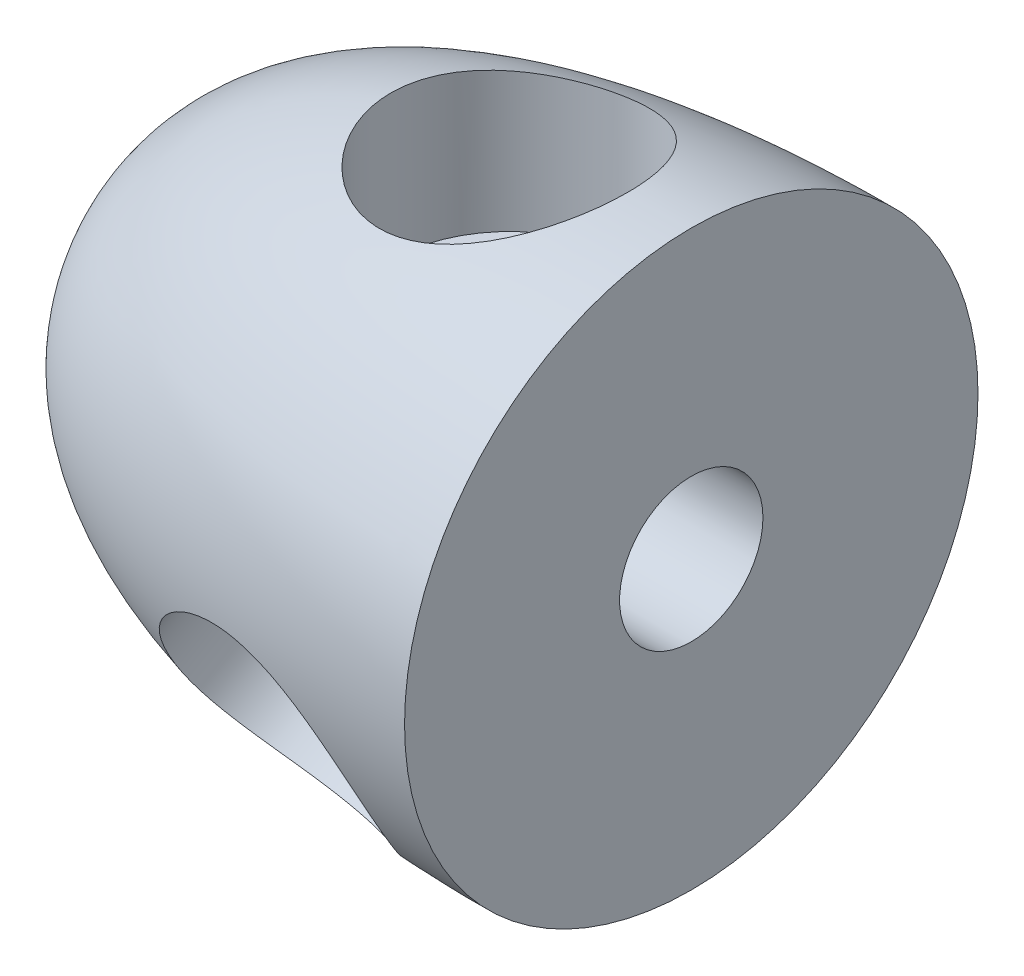
ISO-10303-21;
HEADER;
FILE_DESCRIPTION(('STEP AP214'),'2;1');
FILE_NAME('part.step','',(''),(''),'','','');
FILE_SCHEMA(('AUTOMOTIVE_DESIGN { 1 0 10303 214 1 1 1 1 }'));
ENDSEC;
DATA;
#1=APPLICATION_CONTEXT('core data for automotive mechanical design processes');
#2=APPLICATION_PROTOCOL_DEFINITION('international standard','automotive_design',2000,#1);
#3=PRODUCT_CONTEXT('',#1,'mechanical');
#4=PRODUCT('Part','Part','',(#3));
#5=PRODUCT_RELATED_PRODUCT_CATEGORY('part','',(#4));
#6=PRODUCT_DEFINITION_FORMATION('','',#4);
#7=PRODUCT_DEFINITION_CONTEXT('part definition',#1,'design');
#8=PRODUCT_DEFINITION('design','',#6,#7);
#9=PRODUCT_DEFINITION_SHAPE('','',#8);
#10=(LENGTH_UNIT() NAMED_UNIT(*) SI_UNIT(.MILLI.,.METRE.));
#11=(NAMED_UNIT(*) PLANE_ANGLE_UNIT() SI_UNIT($,.RADIAN.));
#12=(NAMED_UNIT(*) SI_UNIT($,.STERADIAN.) SOLID_ANGLE_UNIT());
#13=UNCERTAINTY_MEASURE_WITH_UNIT(LENGTH_MEASURE(1.E-05),#10,'distance_accuracy_value','');
#14=(GEOMETRIC_REPRESENTATION_CONTEXT(3) GLOBAL_UNCERTAINTY_ASSIGNED_CONTEXT((#13)) GLOBAL_UNIT_ASSIGNED_CONTEXT((#10,
#11,#12)) REPRESENTATION_CONTEXT('',''));
#15=CARTESIAN_POINT('',(0.,0.,0.));
#16=DIRECTION('',(0.,0.,1.));
#17=DIRECTION('',(1.,0.,0.));
#18=AXIS2_PLACEMENT_3D('',#15,#16,#17);
#19=CARTESIAN_POINT('',(0.,20.,0.));
#20=CARTESIAN_POINT('',(-14.46163506969,20.,0.));
#21=CARTESIAN_POINT('',(-38.5,17.4163862746272,0.));
#22=CARTESIAN_POINT('',(-38.5,0.,0.));
#23=B_SPLINE_CURVE_WITH_KNOTS('',3,(#19,#20,#21,#22),.UNSPECIFIED.,.F.,.F.,(4,4),(0.,1.),.UNSPECIFIED.);
#24=CARTESIAN_POINT('',(0.,0.,0.));
#25=DIRECTION('',(1.,0.,0.));
#26=AXIS1_PLACEMENT('',#24,#25);
#27=SURFACE_OF_REVOLUTION('',#23,#26);
#28=CARTESIAN_POINT('',(-12.7,-15.8421062460031,-10.9393329169819));
#29=CARTESIAN_POINT('',(-12.4667718551591,-15.8585433252204,-10.9678045605675));
#30=CARTESIAN_POINT('',(-12.2340146072822,-15.8681369570805,-11.004217427644));
#31=CARTESIAN_POINT('',(-11.7712364735395,-15.8736639800155,-11.0923043389169));
#32=CARTESIAN_POINT('',(-11.5412159015495,-15.8695958190582,-11.1439801164305));
#33=CARTESIAN_POINT('',(-11.0854103190266,-15.8478589256202,-11.2617605081061));
#34=CARTESIAN_POINT('',(-10.859628013026,-15.8301817922321,-11.3278740167084));
#35=CARTESIAN_POINT('',(-10.4139123783304,-15.781302848207,-11.4734647578628));
#36=CARTESIAN_POINT('',(-10.1939793323805,-15.750100385031,-11.5529426350749));
#37=CARTESIAN_POINT('',(-9.76194252633581,-15.674375544408,-11.7238310192057));
#38=CARTESIAN_POINT('',(-9.54981743445234,-15.6298930413038,-11.8152053493589));
#39=CARTESIAN_POINT('',(-9.13395442118094,-15.5276740292496,-12.0088035666243));
#40=CARTESIAN_POINT('',(-8.93021430947051,-15.4699410078469,-12.1110245950769));
#41=CARTESIAN_POINT('',(-8.53222101794735,-15.3413118656078,-12.325019559384));
#42=CARTESIAN_POINT('',(-8.33796473999528,-15.2704200802571,-12.4367903423044));
#43=CARTESIAN_POINT('',(-7.95969344561626,-15.1154491821787,-12.6687353864047));
#44=CARTESIAN_POINT('',(-7.77568987465328,-15.0313557163269,-12.7889187141263));
#45=CARTESIAN_POINT('',(-7.41046878904219,-14.8456991364132,-13.0422844230931));
#46=CARTESIAN_POINT('',(-7.22982288829782,-14.7434849032173,-13.175814791451));
#47=CARTESIAN_POINT('',(-6.88229916665005,-14.5248228947538,-13.4489973692947));
#48=CARTESIAN_POINT('',(-6.71542119324039,-14.4083752771838,-13.5886495109438));
#49=CARTESIAN_POINT('',(-6.39658821561442,-14.1614291811405,-13.8725076712));
#50=CARTESIAN_POINT('',(-6.24463315352734,-14.0309307571601,-14.0167136721445));
#51=CARTESIAN_POINT('',(-5.9568996964979,-13.7562434098754,-14.3079968409556));
#52=CARTESIAN_POINT('',(-5.82111282523077,-13.6120617320298,-14.4550724569084));
#53=CARTESIAN_POINT('',(-5.56778130318162,-13.3115433267783,-14.7493919118753));
#54=CARTESIAN_POINT('',(-5.45010510637893,-13.1553079697358,-14.8966258657814));
#55=CARTESIAN_POINT('',(-5.23299674737624,-12.8304976792463,-15.1905939175841));
#56=CARTESIAN_POINT('',(-5.13354819714245,-12.6619340225697,-15.3373283469195));
#57=CARTESIAN_POINT('',(-4.95385951517676,-12.3132328505923,-15.628734124103));
#58=CARTESIAN_POINT('',(-4.87361556521771,-12.1330976449764,-15.773405876661));
#59=CARTESIAN_POINT('',(-4.73326081524445,-11.762308801365,-16.0590786334291));
#60=CARTESIAN_POINT('',(-4.67315256567265,-11.5716538344673,-16.2000791705485));
#61=CARTESIAN_POINT('',(-4.57784438519257,-11.196907396192,-16.4656780473778));
#62=CARTESIAN_POINT('',(-4.54103473853576,-11.013513769783,-16.5906854553437));
#63=CARTESIAN_POINT('',(-4.48554938315257,-10.6403234066026,-16.8350310708724));
#64=CARTESIAN_POINT('',(-4.46687244495865,-10.4505271048605,-16.9543696622809));
#65=CARTESIAN_POINT('',(-4.4478780579426,-10.0660285793233,-17.1862858595509));
#66=CARTESIAN_POINT('',(-4.44755513718356,-9.87132783502268,-17.298865470488));
#67=CARTESIAN_POINT('',(-4.46525927059064,-9.47852946640415,-17.5163954505091));
#68=CARTESIAN_POINT('',(-4.4832860557062,-9.28043189193374,-17.6213459314303));
#69=CARTESIAN_POINT('',(-4.53595634422012,-8.89359481749504,-17.8172624669073));
#70=CARTESIAN_POINT('',(-4.56961649375037,-8.7049499497614,-17.9086820759108));
#71=CARTESIAN_POINT('',(-4.65274635233297,-8.32749582625799,-18.0836215211304));
#72=CARTESIAN_POINT('',(-4.70221528263639,-8.13868657904244,-18.1671417462118));
#73=CARTESIAN_POINT('',(-4.81647723685187,-7.76226358389381,-18.3259993819725));
#74=CARTESIAN_POINT('',(-4.88127105118392,-7.57464989813762,-18.4013363702879));
#75=CARTESIAN_POINT('',(-5.02558421182367,-7.20194857639171,-18.5436883771845));
#76=CARTESIAN_POINT('',(-5.10510408183272,-7.01686103049029,-18.6107030996601));
#77=CARTESIAN_POINT('',(-5.28054013531686,-6.645505752485,-18.7381147812127));
#78=CARTESIAN_POINT('',(-5.37684243349815,-6.45934209554645,-18.7982830343508));
#79=CARTESIAN_POINT('',(-5.58351619411861,-6.09223011402602,-18.9099910016891));
#80=CARTESIAN_POINT('',(-5.69389271856595,-5.91128369475498,-18.9615275958773));
#81=CARTESIAN_POINT('',(-5.92786692072594,-5.55588136722987,-19.0561858534896));
#82=CARTESIAN_POINT('',(-6.0514636798979,-5.38142500918062,-19.0993081009546));
#83=CARTESIAN_POINT('',(-6.3111089004628,-5.0400487739795,-19.1774826718875));
#84=CARTESIAN_POINT('',(-6.44716183212849,-4.87313163484989,-19.212532082184));
#85=CARTESIAN_POINT('',(-6.74221653036389,-4.53494898033521,-19.2774259068033));
#86=CARTESIAN_POINT('',(-6.90218335348832,-4.36440177694918,-19.3066306152169));
#87=CARTESIAN_POINT('',(-7.23464681497215,-4.03465828136709,-19.3566066649039));
#88=CARTESIAN_POINT('',(-7.40714411119247,-3.87546258600598,-19.3773775630169));
#89=CARTESIAN_POINT('',(-7.76376824003566,-3.56955669693395,-19.4110756173594));
#90=CARTESIAN_POINT('',(-7.94790165574151,-3.42285368308444,-19.4239982888255));
#91=CARTESIAN_POINT('',(-8.32663570182763,-3.14327571502776,-19.4425748307753));
#92=CARTESIAN_POINT('',(-8.52123293480215,-3.01039631318493,-19.4482310458716));
#93=CARTESIAN_POINT('',(-8.93089316869485,-2.7526780238142,-19.4530050336906));
#94=CARTESIAN_POINT('',(-9.14649310980369,-2.62868381477863,-19.4517459271843));
#95=CARTESIAN_POINT('',(-9.58687183263924,-2.39873731417448,-19.4424884196281));
#96=CARTESIAN_POINT('',(-9.8116470750798,-2.29277814579095,-19.4344925942601));
#97=CARTESIAN_POINT('',(-10.2690459399947,-2.10015491716634,-19.4124066901721));
#98=CARTESIAN_POINT('',(-10.5016696529847,-2.01349107954409,-19.3983165411448));
#99=CARTESIAN_POINT('',(-10.9731807257754,-1.86069604069797,-19.3646290934994));
#100=CARTESIAN_POINT('',(-11.2120677480791,-1.79456373559295,-19.3450320910662));
#101=CARTESIAN_POINT('',(-11.6864897537168,-1.68571575742572,-19.3015631953056));
#102=CARTESIAN_POINT('',(-11.9218803159202,-1.64230726943994,-19.2778514076496));
#103=CARTESIAN_POINT('',(-12.395123743142,-1.57650290531533,-19.2261309817635));
#104=CARTESIAN_POINT('',(-12.6329765679636,-1.55410668669403,-19.198122413576));
#105=CARTESIAN_POINT('',(-13.1091284030411,-1.5308586918442,-19.1381005204183));
#106=CARTESIAN_POINT('',(-13.347427169278,-1.52999738629654,-19.1060889730912));
#107=CARTESIAN_POINT('',(-13.8225561280998,-1.55000728966866,-19.0382170874326));
#108=CARTESIAN_POINT('',(-14.0593864048711,-1.57087724095907,-19.0023569719329));
#109=CARTESIAN_POINT('',(-14.5130404976927,-1.63198492642163,-18.9294794668522));
#110=CARTESIAN_POINT('',(-14.7301035592465,-1.67076340261671,-18.8927191476772));
#111=CARTESIAN_POINT('',(-15.1595414371732,-1.76660122050711,-18.8158501956869));
#112=CARTESIAN_POINT('',(-15.3719164922475,-1.823659629129,-18.77574173385));
#113=CARTESIAN_POINT('',(-15.7904073502397,-1.95543066712245,-18.692035359287));
#114=CARTESIAN_POINT('',(-15.996523061287,-2.03014355547408,-18.6484373953784));
#115=CARTESIAN_POINT('',(-16.4010103073797,-2.19638526816825,-18.5575415600228));
#116=CARTESIAN_POINT('',(-16.5993817298788,-2.28791433678683,-18.5102436348351));
#117=CARTESIAN_POINT('',(-16.9851108246466,-2.4858081533447,-18.4121670365609));
#118=CARTESIAN_POINT('',(-17.1725569944599,-2.59201961949378,-18.3614267792591));
#119=CARTESIAN_POINT('',(-17.5373492212601,-2.81887977925409,-18.2557563949271));
#120=CARTESIAN_POINT('',(-17.7146915755059,-2.93953371599718,-18.2008247489134));
#121=CARTESIAN_POINT('',(-18.0580443671635,-3.19402358392044,-18.0865061496481));
#122=CARTESIAN_POINT('',(-18.2240576921773,-3.32785613466028,-18.0271203398587));
#123=CARTESIAN_POINT('',(-18.5438601671766,-3.6075397521864,-17.9035687078603));
#124=CARTESIAN_POINT('',(-18.6976436779761,-3.7533963008491,-17.83940070669));
#125=CARTESIAN_POINT('',(-18.9976964148481,-4.06165979582292,-17.703462030949));
#126=CARTESIAN_POINT('',(-19.14344170339,-4.22448955334053,-17.6314928563526));
#127=CARTESIAN_POINT('',(-19.4196356509824,-4.56010711025286,-17.481954652667));
#128=CARTESIAN_POINT('',(-19.5500906687032,-4.73289072529148,-17.4043879732159));
#129=CARTESIAN_POINT('',(-19.7949682756709,-5.08705043383503,-17.2434475550785));
#130=CARTESIAN_POINT('',(-19.9093831398271,-5.26843061164293,-17.1600710470639));
#131=CARTESIAN_POINT('',(-20.1212804019227,-5.63809357065035,-16.9875399851364));
#132=CARTESIAN_POINT('',(-20.2187691767031,-5.82637371979298,-16.8983876247128));
#133=CARTESIAN_POINT('',(-20.3975152213318,-6.21123014271892,-16.7129683456149));
#134=CARTESIAN_POINT('',(-20.478505033068,-6.40788877645305,-16.6166142938504));
#135=CARTESIAN_POINT('',(-20.621759532771,-6.80513439811961,-16.4182382720141));
#136=CARTESIAN_POINT('',(-20.6840239857903,-7.00572143530817,-16.316216230845));
#137=CARTESIAN_POINT('',(-20.789329192703,-7.40915342570636,-16.10690065573));
#138=CARTESIAN_POINT('',(-20.8323719428985,-7.6119981421972,-15.9996076704922));
#139=CARTESIAN_POINT('',(-20.8988918452291,-8.01833233501916,-15.7802846079461));
#140=CARTESIAN_POINT('',(-20.9223693549952,-8.22182179949674,-15.6682546172642));
#141=CARTESIAN_POINT('',(-20.9493315843224,-8.62436263215322,-15.4421183826934));
#142=CARTESIAN_POINT('',(-20.9531530425569,-8.82343016084805,-15.3280809340602));
#143=CARTESIAN_POINT('',(-20.9416803639022,-9.21920023366537,-15.0969091923564));
#144=CARTESIAN_POINT('',(-20.926386433763,-9.41590280334377,-14.9797749327941));
#145=CARTESIAN_POINT('',(-20.8768071910272,-9.80556834265398,-14.7433421637457));
#146=CARTESIAN_POINT('',(-20.8425224342791,-9.99853142156707,-14.6240437177028));
#147=CARTESIAN_POINT('',(-20.7552340208847,-10.3794567456688,-14.3843192709324));
#148=CARTESIAN_POINT('',(-20.7022303349796,-10.5674189830404,-14.2638932684428));
#149=CARTESIAN_POINT('',(-20.5782870205947,-10.9360823437135,-14.0237705334901));
#150=CARTESIAN_POINT('',(-20.5074566240195,-11.1168201883398,-13.9040737495218));
#151=CARTESIAN_POINT('',(-20.3482306751363,-11.4712048868642,-13.6658793367394));
#152=CARTESIAN_POINT('',(-20.2598352181358,-11.6448517792315,-13.5473817014224));
#153=CARTESIAN_POINT('',(-20.0661146988663,-11.9841562348478,-13.3128440994646));
#154=CARTESIAN_POINT('',(-19.9607906999032,-12.1498142990376,-13.1968039789814));
#155=CARTESIAN_POINT('',(-19.7338888184714,-12.4724414154935,-12.9684297532175));
#156=CARTESIAN_POINT('',(-19.6123047583182,-12.629407133066,-12.8560970768302));
#157=CARTESIAN_POINT('',(-19.3514896831627,-12.9365395951482,-12.6346264471274));
#158=CARTESIAN_POINT('',(-19.2119907487538,-13.086542633139,-12.5255768650456));
#159=CARTESIAN_POINT('',(-18.9179056424185,-13.37625725428,-12.3141244645617));
#160=CARTESIAN_POINT('',(-18.7633125121742,-13.5159640383564,-12.2117247482651));
#161=CARTESIAN_POINT('',(-18.4400952165389,-13.7845031336472,-12.0150544866638));
#162=CARTESIAN_POINT('',(-18.2714691557402,-13.9133339711138,-11.9207850430163));
#163=CARTESIAN_POINT('',(-17.9214125773397,-14.1595803098131,-11.7418628124831));
#164=CARTESIAN_POINT('',(-17.7399882040064,-14.2770012252591,-11.6572054612418));
#165=CARTESIAN_POINT('',(-17.3648376537152,-14.5004841601517,-11.4985601036312));
#166=CARTESIAN_POINT('',(-17.1710702726545,-14.6065045758974,-11.4246108552871));
#167=CARTESIAN_POINT('',(-16.7732719441253,-14.8063006772114,-11.2890835651378));
#168=CARTESIAN_POINT('',(-16.5692451626175,-14.900081278173,-11.2275005517859));
#169=CARTESIAN_POINT('',(-16.1524581060346,-15.0750867831418,-11.1178728946794));
#170=CARTESIAN_POINT('',(-15.9397013676721,-15.1563167093918,-11.0698228292516));
#171=CARTESIAN_POINT('',(-15.507038387883,-15.305980121887,-10.9882253478292));
#172=CARTESIAN_POINT('',(-15.2871329568641,-15.3744150527323,-10.9546762940573));
#173=CARTESIAN_POINT('',(-14.8723974605994,-15.4897927979212,-10.9063660743483));
#174=CARTESIAN_POINT('',(-14.6782507283509,-15.5383948901863,-10.8896630416048));
#175=CARTESIAN_POINT('',(-14.2870547982499,-15.6258049183804,-10.8679111476111));
#176=CARTESIAN_POINT('',(-14.0900047846298,-15.6646100437762,-10.8628656272672));
#177=CARTESIAN_POINT('',(-13.6942650906515,-15.7323277681105,-10.8645732569504));
#178=CARTESIAN_POINT('',(-13.495575416627,-15.7612404052442,-10.8713263614218));
#179=CARTESIAN_POINT('',(-13.0978097802928,-15.8091252788369,-10.896577417515));
#180=CARTESIAN_POINT('',(-12.8987339366255,-15.8281001942819,-10.9150722008672));
#181=CARTESIAN_POINT('',(-12.7,-15.8421062460031,-10.9393329169819));
#182=B_SPLINE_CURVE_WITH_KNOTS('',3,(#28,#29,#30,#31,#32,#33,#34,#35,#36,#37,#38,#39,#40,#41,
#42,#43,#44,#45,#46,#47,#48,#49,#50,#51,#52,#53,#54,#55,#56,#57,#58,#59,#60,#61,#62,#63,#64,#65,
#66,#67,#68,#69,#70,#71,#72,#73,#74,#75,#76,#77,#78,#79,#80,#81,#82,#83,#84,#85,#86,#87,#88,#89,
#90,#91,#92,#93,#94,#95,#96,#97,#98,#99,#100,#101,#102,#103,#104,#105,#106,#107,#108,#109,#110,
#111,#112,#113,#114,#115,#116,#117,#118,#119,#120,#121,#122,#123,#124,#125,#126,#127,#128,#129,
#130,#131,#132,#133,#134,#135,#136,#137,#138,#139,#140,#141,#142,#143,#144,#145,#146,#147,#148,
#149,#150,#151,#152,#153,#154,#155,#156,#157,#158,#159,#160,#161,#162,#163,#164,#165,#166,#167,
#168,#169,#170,#171,#172,#173,#174,#175,#176,#177,#178,#179,#180,#181),.UNSPECIFIED.,.T.,.F.,(4,
2,2,2,2,2,2,2,2,2,2,2,2,2,2,2,2,2,2,2,2,2,2,2,2,2,2,2,2,2,2,2,2,2,2,2,2,2,2,2,2,2,2,2,2,2,2,2,2,
2,2,2,2,2,2,2,2,2,2,2,2,2,2,2,2,2,2,2,2,2,2,2,2,2,2,2,4),(0.,0.706404035143958,1.41288832321816,
2.11980907868325,2.82676394383258,3.53161711343302,4.23628497741696,4.94072108163443,
5.64592843537285,6.38546349857302,7.12499036890082,7.86451437124356,8.60364894808951,
9.33713190617726,10.0699521376383,10.8026265497202,11.5353937292714,12.2094559673424,
12.8834724982021,13.5572880814874,14.2310937851677,14.867300694049,15.5034762678704,
16.1396846612283,16.7759156843526,17.4293977705889,18.0831155580104,18.7367879546468,
19.3906958678234,20.0968553163374,20.8030518656797,21.5096515827647,22.2160232493648,
22.9612606325816,23.7062132148558,24.4511743915349,25.1960955083174,25.9167432896303,
26.6373793247812,27.3576964688213,28.0779719290484,28.7477877027364,29.4175692920667,
30.0873607072796,30.7571618528196,31.4204351399608,32.0839499534352,32.7472950101944,
33.4109441839729,34.1003726724273,34.7895134275295,35.4789849475119,36.1681961453449,
36.8678192473116,37.5674511270963,38.2670103285358,38.9665567425267,39.654077949204,
40.3415917197898,41.02908536838,41.7165800915653,42.3999606517846,43.0833375040999,
43.766671449301,44.4502657550397,45.1456362260857,45.8413287852747,46.5371154636394,
47.2325703496804,47.9304826808355,48.6281138689401,49.3254651678443,50.0227376857132,
50.6246575105496,51.2267498171616,51.8288397990412,52.4307673873606),.UNSPECIFIED.);
#183=CARTESIAN_POINT('',(-12.7,-15.8421062460031,-10.9393329169819));
#184=VERTEX_POINT('',#183);
#185=EDGE_CURVE('E76',#184,#184,#182,.T.);
#186=ORIENTED_EDGE('',*,*,#185,.T.);
#187=EDGE_LOOP('',(#186));
#188=FACE_BOUND('',#187,.T.);
#189=CARTESIAN_POINT('',(0.,0.,0.));
#190=DIRECTION('',(1.,0.,0.));
#191=DIRECTION('',(0.,0.,-1.));
#192=AXIS2_PLACEMENT_3D('',#189,#190,#191);
#193=CIRCLE('',#192,20.);
#194=CARTESIAN_POINT('',(0.,0.,-20.));
#195=VERTEX_POINT('',#194);
#196=EDGE_CURVE('E11',#195,#195,#193,.T.);
#197=ORIENTED_EDGE('',*,*,#196,.F.);
#198=EDGE_LOOP('',(#197));
#199=FACE_BOUND('',#198,.T.);
#200=CARTESIAN_POINT('',(-38.5,0.,0.));
#201=VERTEX_POINT('',#200);
#202=VERTEX_LOOP('',#201);
#203=FACE_BOUND('',#202,.T.);
#204=CARTESIAN_POINT('',(-4.45,19.9158149709492,0.));
#205=CARTESIAN_POINT('',(-4.44999999766579,19.915814969002,0.21883423257162));
#206=CARTESIAN_POINT('',(-4.45871540904189,19.9118652641695,0.437668625578417));
#207=CARTESIAN_POINT('',(-4.4934765602789,19.8961539783383,0.873670760669621));
#208=CARTESIAN_POINT('',(-4.51952228410439,19.884392404568,1.09083850429596));
#209=CARTESIAN_POINT('',(-4.58865570220318,19.8533123481581,1.52192544906785));
#210=CARTESIAN_POINT('',(-4.63174610802638,19.8339926631434,1.73584412771117));
#211=CARTESIAN_POINT('',(-4.73450313775157,19.7882092192167,2.15887495734927));
#212=CARTESIAN_POINT('',(-4.79416987057492,19.7617454133615,2.36798707675085));
#213=CARTESIAN_POINT('',(-4.92928395711506,19.7023036538169,2.77942979523535));
#214=CARTESIAN_POINT('',(-5.00468691813081,19.6693440393851,2.98177765226754));
#215=CARTESIAN_POINT('',(-5.17069880966638,19.5975010972691,3.37912796497673));
#216=CARTESIAN_POINT('',(-5.26131342191659,19.5586155566842,3.57412764257458));
#217=CARTESIAN_POINT('',(-5.45693205197325,19.4756729041446,3.95555256554184));
#218=CARTESIAN_POINT('',(-5.5619326677416,19.4316170152391,4.14197982425807));
#219=CARTESIAN_POINT('',(-5.78557128738347,19.3391017445976,4.50541023974154));
#220=CARTESIAN_POINT('',(-5.90421460751343,19.2906406478021,4.68240968311999));
#221=CARTESIAN_POINT('',(-6.16022467624586,19.1877763513691,5.03422152823631));
#222=CARTESIAN_POINT('',(-6.29821291494192,19.1332002752139,5.20853115878392));
#223=CARTESIAN_POINT('',(-6.58733407544924,19.0211133440262,5.54500155766878));
#224=CARTESIAN_POINT('',(-6.7384728014036,18.9636011977954,5.70715690217219));
#225=CARTESIAN_POINT('',(-7.05293594878401,18.8466652660974,6.01848206530201));
#226=CARTESIAN_POINT('',(-7.2162620321556,18.7872412205423,6.16765010686554));
#227=CARTESIAN_POINT('',(-7.55416399249716,18.6675075576482,6.45226103002294));
#228=CARTESIAN_POINT('',(-7.72874030215312,18.6071979063176,6.58770338320802));
#229=CARTESIAN_POINT('',(-8.1015705096534,18.4822419592909,6.85369969116889));
#230=CARTESIAN_POINT('',(-8.30062013190763,18.4176059243357,6.98314524877343));
#231=CARTESIAN_POINT('',(-8.70940125327942,18.2897751549881,7.2245378434309));
#232=CARTESIAN_POINT('',(-8.91912905373862,18.2265799323675,7.33649088552254));
#233=CARTESIAN_POINT('',(-9.34822077935216,18.1028128989307,7.54219526639169));
#234=CARTESIAN_POINT('',(-9.56758953786112,18.0422424349275,7.63593734472748));
#235=CARTESIAN_POINT('',(-10.0144404295659,17.924983998356,7.80430956761132));
#236=CARTESIAN_POINT('',(-10.2419189654922,17.8682943361726,7.87894806870094));
#237=CARTESIAN_POINT('',(-10.7033485402293,17.7599572094862,8.00832225985486));
#238=CARTESIAN_POINT('',(-10.9372917205747,17.7083039412708,8.06308106148057));
#239=CARTESIAN_POINT('',(-11.4102799066594,17.6109734420385,8.1521180131262));
#240=CARTESIAN_POINT('',(-11.6493249506275,17.5652962558191,8.18639600962552));
#241=CARTESIAN_POINT('',(-12.1305774677711,17.480786685404,8.23387450717));
#242=CARTESIAN_POINT('',(-12.3727832290723,17.441950748736,8.24708597635106));
#243=CARTESIAN_POINT('',(-12.8584887502184,17.371725459995,8.25205129979113));
#244=CARTESIAN_POINT('',(-13.1019884121063,17.3403355521936,8.24380675595267));
#245=CARTESIAN_POINT('',(-13.5711636019035,17.2872841042467,8.20701003997349));
#246=CARTESIAN_POINT('',(-13.7968951351401,17.2650958699785,8.17991786548108));
#247=CARTESIAN_POINT('',(-14.2458939063545,17.2275300114157,8.10706055541825));
#248=CARTESIAN_POINT('',(-14.4691612615111,17.2121520619,8.0612963117222));
#249=CARTESIAN_POINT('',(-14.9114501098198,17.1880390685167,7.95134660287535));
#250=CARTESIAN_POINT('',(-15.1304720582332,17.1793033084824,7.88716312473097));
#251=CARTESIAN_POINT('',(-15.5625838528131,17.1680835829237,7.74081048423575));
#252=CARTESIAN_POINT('',(-15.7756737373339,17.1655995769687,7.65864143820296));
#253=CARTESIAN_POINT('',(-16.1867116548699,17.1662882762076,7.48022132353649));
#254=CARTESIAN_POINT('',(-16.3849285820182,17.1692594754384,7.38458765842337));
#255=CARTESIAN_POINT('',(-16.7730626445379,17.1798110988832,7.17781503257515));
#256=CARTESIAN_POINT('',(-16.9629767777824,17.1873931757643,7.06667052333176));
#257=CARTESIAN_POINT('',(-17.3331303562256,17.2064069223445,6.82970590590524));
#258=CARTESIAN_POINT('',(-17.5133725690981,17.217837483894,6.7038900290692));
#259=CARTESIAN_POINT('',(-17.8631871345281,17.2437324717845,6.43834176360299));
#260=CARTESIAN_POINT('',(-18.0327545692467,17.2581982833501,6.29860303621985));
#261=CARTESIAN_POINT('',(-18.3651299058113,17.289784520218,6.00166454048908));
#262=CARTESIAN_POINT('',(-18.5275700104965,17.3069728559774,5.84406018077208));
#263=CARTESIAN_POINT('',(-18.8388223779898,17.3427148798719,5.51619744005059));
#264=CARTESIAN_POINT('',(-18.9876401935298,17.3612680060772,5.34594426669998));
#265=CARTESIAN_POINT('',(-19.2708570858777,17.3988417634065,4.99373888746327));
#266=CARTESIAN_POINT('',(-19.4052485115613,17.4178626360945,4.81178055468451));
#267=CARTESIAN_POINT('',(-19.6586125840083,17.4554871298905,4.43748427915915));
#268=CARTESIAN_POINT('',(-19.7775907053883,17.4740908971969,4.24515005637254));
#269=CARTESIAN_POINT('',(-20.0025937684776,17.5106052309477,3.84560618440444));
#270=CARTESIAN_POINT('',(-20.1081477349531,17.5284804703425,3.6381277989526));
#271=CARTESIAN_POINT('',(-20.3014055192584,17.5621692272962,3.2148504666648));
#272=CARTESIAN_POINT('',(-20.3891089712168,17.5779827025939,2.99905134939161));
#273=CARTESIAN_POINT('',(-20.5459999726038,17.606878560672,2.56065998341158));
#274=CARTESIAN_POINT('',(-20.6151887923338,17.6199611308081,2.33806820192197));
#275=CARTESIAN_POINT('',(-20.7345172061825,17.6428554505402,1.88767179965939));
#276=CARTESIAN_POINT('',(-20.7846571181251,17.6526672547073,1.65986726592646));
#277=CARTESIAN_POINT('',(-20.865069878737,17.6685386617029,1.20306449226887));
#278=CARTESIAN_POINT('',(-20.8955414721233,17.6746357644541,0.974102538406238));
#279=CARTESIAN_POINT('',(-20.9371844024944,17.6829935728598,0.514359866118501));
#280=CARTESIAN_POINT('',(-20.948355834987,17.6852542974987,0.283579156699277));
#281=CARTESIAN_POINT('',(-20.9513069749538,17.6858501961051,-0.178093809484552));
#282=CARTESIAN_POINT('',(-20.943088122364,17.684185661565,-0.40898605669324));
#283=CARTESIAN_POINT('',(-20.9073289564213,17.6769971986494,-0.869207173620354));
#284=CARTESIAN_POINT('',(-20.8797887834035,17.6714732983053,-1.09853605468164));
#285=CARTESIAN_POINT('',(-20.8061349053424,17.6568886098712,-1.55074689307801));
#286=CARTESIAN_POINT('',(-20.7602887993562,17.6478788353315,-1.7736741588816));
#287=CARTESIAN_POINT('',(-20.6503886842258,17.6266700119492,-2.21483515121464));
#288=CARTESIAN_POINT('',(-20.5863348694926,17.6144709971596,-2.4330689278316));
#289=CARTESIAN_POINT('',(-20.4405060816623,17.5873636645927,-2.86333002689782));
#290=CARTESIAN_POINT('',(-20.3587330482055,17.5724556433866,-3.07535802578342));
#291=CARTESIAN_POINT('',(-20.178017155268,17.5405197460369,-3.49189355202868));
#292=CARTESIAN_POINT('',(-20.0790677607784,17.523491063755,-3.69639818098651));
#293=CARTESIAN_POINT('',(-19.8634732498358,17.4878154426493,-4.09876107071814));
#294=CARTESIAN_POINT('',(-19.746637749553,17.4691521483779,-4.29651587527498));
#295=CARTESIAN_POINT('',(-19.4968669880422,17.4311886311276,-4.68164521663507));
#296=CARTESIAN_POINT('',(-19.363924392653,17.4118881209323,-4.86901496771355));
#297=CARTESIAN_POINT('',(-19.0828452796989,17.3735505956689,-5.23206423787923));
#298=CARTESIAN_POINT('',(-18.9347064685413,17.3545136208702,-5.40774198565388));
#299=CARTESIAN_POINT('',(-18.6242937526137,17.3176653757783,-5.74612342650395));
#300=CARTESIAN_POINT('',(-18.4620262917949,17.2998535532708,-5.90883297007415));
#301=CARTESIAN_POINT('',(-18.121986351851,17.2661917272896,-6.22244361207402));
#302=CARTESIAN_POINT('',(-17.9440281594632,17.2503727809252,-6.3731468325654));
#303=CARTESIAN_POINT('',(-17.5758995962422,17.2220242284625,-6.65900810163735));
#304=CARTESIAN_POINT('',(-17.3857341409691,17.2094933085716,-6.79417234694021));
#305=CARTESIAN_POINT('',(-16.9944691785213,17.1887012131985,-7.04800769598017));
#306=CARTESIAN_POINT('',(-16.7933696994141,17.1804400267566,-7.1666788420523));
#307=CARTESIAN_POINT('',(-16.3817202545479,17.169098546055,-7.38660175745897));
#308=CARTESIAN_POINT('',(-16.171170588382,17.1660180876732,-7.48785407852009));
#309=CARTESIAN_POINT('',(-15.7476061963418,17.1658245476099,-7.66983648589321));
#310=CARTESIAN_POINT('',(-15.5347848361019,17.1685641416625,-7.75101651857662));
#311=CARTESIAN_POINT('',(-15.1033130069137,17.180282495904,-7.89546330875574));
#312=CARTESIAN_POINT('',(-14.8846626396017,17.1892611473751,-7.95873037836422));
#313=CARTESIAN_POINT('',(-14.4432844229655,17.2138313612981,-8.06691256898139));
#314=CARTESIAN_POINT('',(-14.2205574980339,17.2294214419035,-8.11183179793996));
#315=CARTESIAN_POINT('',(-13.7727263726451,17.2673730620416,-8.18310234633226));
#316=CARTESIAN_POINT('',(-13.5476222152518,17.2897344791127,-8.20945400153756));
#317=CARTESIAN_POINT('',(-13.104253733831,17.3403061469845,-8.24298844096066));
#318=CARTESIAN_POINT('',(-12.8860099281311,17.3682980381903,-8.25077747074305));
#319=CARTESIAN_POINT('',(-12.4504540312587,17.4302878550252,-8.24910020066968));
#320=CARTESIAN_POINT('',(-12.2331419159269,17.464285623941,-8.23963435099068));
#321=CARTESIAN_POINT('',(-11.8008582946219,17.537861982039,-8.20372432589544));
#322=CARTESIAN_POINT('',(-11.5858870854521,17.5774412702276,-8.17727802244155));
#323=CARTESIAN_POINT('',(-11.1596388809505,17.661602034106,-8.10780004323826));
#324=CARTESIAN_POINT('',(-10.948362004822,17.7061836708613,-8.0647678333479));
#325=CARTESIAN_POINT('',(-10.5247117900001,17.801002974404,-7.96112648938661));
#326=CARTESIAN_POINT('',(-10.3124816613717,17.8513664304695,-7.90004745117776));
#327=CARTESIAN_POINT('',(-9.89434458680147,17.9558288430667,-7.76140032330686));
#328=CARTESIAN_POINT('',(-9.68843996486727,18.0099291493638,-7.68382625432208));
#329=CARTESIAN_POINT('',(-9.28412404408083,18.120936655842,-7.51282030276251));
#330=CARTESIAN_POINT('',(-9.08571247264353,18.1778437537426,-7.41938899772898));
#331=CARTESIAN_POINT('',(-8.69730633881525,18.2935347467195,-7.21726354246564));
#332=CARTESIAN_POINT('',(-8.50731482150025,18.3523193077596,-7.10856392882474));
#333=CARTESIAN_POINT('',(-8.12353139698463,18.4749997290627,-6.86828065959693));
#334=CARTESIAN_POINT('',(-7.93043512086211,18.5389610783846,-6.73561773227039));
#335=CARTESIAN_POINT('',(-7.55617145535644,18.6666836083817,-6.45432657487071));
#336=CARTESIAN_POINT('',(-7.37500433264798,18.7304447845518,-6.30569798808259));
#337=CARTESIAN_POINT('',(-7.02560252959441,18.8565818563931,-5.99321865577364));
#338=CARTESIAN_POINT('',(-6.85737452119634,18.9189570257494,-5.82936015197192));
#339=CARTESIAN_POINT('',(-6.53511978167222,19.0410506249672,-5.4874329866296));
#340=CARTESIAN_POINT('',(-6.3810876685124,19.1007700572072,-5.3093697586335));
#341=CARTESIAN_POINT('',(-6.08509674528568,19.2176343232753,-4.93594332598835));
#342=CARTESIAN_POINT('',(-5.94347148229097,19.2746954357394,-4.74028905866146));
#343=CARTESIAN_POINT('',(-5.67739668722295,19.3835574659924,-4.33635823051827));
#344=CARTESIAN_POINT('',(-5.5529400448796,19.4353605589925,-4.12808694669667));
#345=CARTESIAN_POINT('',(-5.32237339206949,19.5325314673992,-3.70028965740295));
#346=CARTESIAN_POINT('',(-5.21625627055532,19.5779017758513,-3.48076805717967));
#347=CARTESIAN_POINT('',(-5.02346543351951,19.6611345923576,-3.03198573789233));
#348=CARTESIAN_POINT('',(-4.93678914745042,19.698998092916,-2.80272631117735));
#349=CARTESIAN_POINT('',(-4.7929237177303,19.7622970136632,-2.3637942805867));
#350=CARTESIAN_POINT('',(-4.73346296730704,19.7886713509923,-2.1549988421661));
#351=CARTESIAN_POINT('',(-4.63106834014008,19.834295984268,-1.73264103479198));
#352=CARTESIAN_POINT('',(-4.58813260547902,19.8535470810755,-1.51907920458482));
#353=CARTESIAN_POINT('',(-4.51925650990966,19.8845123270193,-1.08876100663879));
#354=CARTESIAN_POINT('',(-4.49331063149096,19.8962289229869,-0.872005699397037));
#355=CARTESIAN_POINT('',(-4.45868220939849,19.9118803217892,-0.436833669585716));
#356=CARTESIAN_POINT('',(-4.45000000232975,19.9158149728926,-0.218416914704787));
#357=CARTESIAN_POINT('',(-4.45,19.9158149709492,0.));
#358=B_SPLINE_CURVE_WITH_KNOTS('',3,(#204,#205,#206,#207,#208,#209,#210,#211,#212,#213,#214,
#215,#216,#217,#218,#219,#220,#221,#222,#223,#224,#225,#226,#227,#228,#229,#230,#231,#232,#233,
#234,#235,#236,#237,#238,#239,#240,#241,#242,#243,#244,#245,#246,#247,#248,#249,#250,#251,#252,
#253,#254,#255,#256,#257,#258,#259,#260,#261,#262,#263,#264,#265,#266,#267,#268,#269,#270,#271,
#272,#273,#274,#275,#276,#277,#278,#279,#280,#281,#282,#283,#284,#285,#286,#287,#288,#289,#290,
#291,#292,#293,#294,#295,#296,#297,#298,#299,#300,#301,#302,#303,#304,#305,#306,#307,#308,#309,
#310,#311,#312,#313,#314,#315,#316,#317,#318,#319,#320,#321,#322,#323,#324,#325,#326,#327,#328,
#329,#330,#331,#332,#333,#334,#335,#336,#337,#338,#339,#340,#341,#342,#343,#344,#345,#346,#347,
#348,#349,#350,#351,#352,#353,#354,#355,#356,#357),.UNSPECIFIED.,.T.,.F.,(4,2,2,2,2,2,2,2,2,2,2,
2,2,2,2,2,2,2,2,2,2,2,2,2,2,2,2,2,2,2,2,2,2,2,2,2,2,2,2,2,2,2,2,2,2,2,2,2,2,2,2,2,2,2,2,2,2,2,2,
2,2,2,2,2,2,2,2,2,2,2,2,2,2,2,2,2,4),(0.,0.656295090595926,1.31258957393454,1.96898850576998,
2.62539175083838,3.27996769164305,3.93478867046758,4.58945506201677,5.2443774324862,
5.93039247205043,6.61671184448761,7.30312497943912,7.98956452975418,8.72693737747882,
9.46405653227738,10.2015495433535,10.9387193969105,11.6750294728132,12.4113450679006,
13.1472771802524,13.8831543496055,14.5675864522326,15.251985866677,15.9363114780997,
16.6206326639144,17.2801829021515,17.9399696810474,18.5995666402857,19.2594652830685,
19.9396406372164,20.6195374912984,21.2997931696311,21.9798065631366,22.6793781897898,
23.3789641536995,24.0785021062345,24.7780283867305,25.4703705925223,26.162709372214,
26.8549967399652,27.5472790795318,28.2297917594358,28.9122971521528,29.5947278718913,
30.2774188041802,30.967959313487,31.6588154417522,32.3497759960537,33.0404230438488,
33.7407673582731,34.4408314093813,35.1408936635091,35.8409337396711,36.5234649703855,
37.2059843080469,37.8883507506543,38.5707048531931,39.2304484769295,39.8901748883179,
40.5499839945953,41.2098143514758,41.8886207896468,42.5676737107285,43.2467019051202,
43.925973695967,44.6536991666304,45.3814408999845,46.1095554060137,46.8373927194074,
47.5809862249907,48.3242708457612,49.067266612262,49.8101640788072,50.4654814375376,
51.1207250970092,51.7757558583249,52.4307993912281),.UNSPECIFIED.);
#359=CARTESIAN_POINT('',(-4.45,19.9158149709492,0.));
#360=VERTEX_POINT('',#359);
#361=EDGE_CURVE('E70',#360,#360,#358,.T.);
#362=ORIENTED_EDGE('',*,*,#361,.T.);
#363=EDGE_LOOP('',(#362));
#364=FACE_BOUND('',#363,.T.);
#365=CARTESIAN_POINT('',(-12.7,-1.55268708356005,19.1893329169818));
#366=CARTESIAN_POINT('',(-12.4667718551591,-1.56912571058402,19.2178036669408));
#367=CARTESIAN_POINT('',(-12.2340146072822,-1.5958633625668,19.2443184293844));
#368=CARTESIAN_POINT('',(-11.7712364735395,-1.66938535400253,19.2931484272899));
#369=CARTESIAN_POINT('',(-11.5412159015495,-1.71617197056823,19.315463185311));
#370=CARTESIAN_POINT('',(-11.0854103190266,-1.82904122854605,19.3555286792321));
#371=CARTESIAN_POINT('',(-10.859628013026,-1.89513577322301,19.3732765869531));
#372=CARTESIAN_POINT('',(-10.4139123783304,-2.04566052563102,19.4037415502944));
#373=CARTESIAN_POINT('',(-10.1939793323805,-2.1300916179236,19.4164583631294));
#374=CARTESIAN_POINT('',(-9.76194252633581,-2.31594772010408,19.4363229195178));
#375=CARTESIAN_POINT('',(-9.54981743445234,-2.4173214628226,19.4434871068821));
#376=CARTESIAN_POINT('',(-9.13395442118094,-2.63609194312892,19.4517619543261));
#377=CARTESIAN_POINT('',(-8.93021430947051,-2.7534844612712,19.4528742053805));
#378=CARTESIAN_POINT('',(-8.53222101794736,-3.00312410776262,19.448475582688));
#379=CARTESIAN_POINT('',(-8.33796473999528,-3.13536633784792,19.4429668871148));
#380=CARTESIAN_POINT('',(-7.95969344561627,-3.41372208735985,19.4247306745818));
#381=CARTESIAN_POINT('',(-7.77568987465329,-3.55985063520406,19.4119952607227));
#382=CARTESIAN_POINT('',(-7.4104687890422,-3.87210006557406,19.3778948006211));
#383=CARTESIAN_POINT('',(-7.22982288829783,-4.03884787334662,19.3561398622241));
#384=CARTESIAN_POINT('',(-6.88229916665005,-4.38476192986228,19.303364296974));
#385=CARTESIAN_POINT('',(-6.71542119324039,-4.56392804100833,19.2723437727728));
#386=CARTESIAN_POINT('',(-6.39658821561443,-4.93322946688339,19.200411260362));
#387=CARTESIAN_POINT('',(-6.24463315352735,-5.12336473906965,19.1594993105133));
#388=CARTESIAN_POINT('',(-5.9568996964979,-5.51296703659721,19.0672546740722));
#389=CARTESIAN_POINT('',(-5.82111282523078,-5.71242909521243,19.015927486274));
#390=CARTESIAN_POINT('',(-5.56778130318162,-6.11757642266746,18.9028306405049));
#391=CARTESIAN_POINT('',(-5.45010510637894,-6.3232024455711,18.8411438292898));
#392=CARTESIAN_POINT('',(-5.23299674737624,-6.74019139157798,18.7068338922166));
#393=CARTESIAN_POINT('',(-5.13354819714245,-6.95154896333054,18.6342206980476));
#394=CARTESIAN_POINT('',(-4.95385951517676,-7.37826435516967,18.4779395133775));
#395=CARTESIAN_POINT('',(-4.87361556521771,-7.59362137090288,18.3942737254773));
#396=CARTESIAN_POINT('',(-4.73326081524445,-8.02641565723889,18.2159975458539));
#397=CARTESIAN_POINT('',(-4.67315256567265,-8.24385318778041,18.1213857697226));
#398=CARTESIAN_POINT('',(-4.57784438519257,-8.66124178146883,17.9296452726131));
#399=CARTESIAN_POINT('',(-4.54103473853576,-8.86119818563303,17.8333254372337));
#400=CARTESIAN_POINT('',(-4.48554938315257,-9.25940287757442,17.6323059100363));
#401=CARTESIAN_POINT('',(-4.46687244495865,-9.45765128025717,17.5276067868875));
#402=CARTESIAN_POINT('',(-4.4478780579426,-9.85074586141065,17.3105793946896));
#403=CARTESIAN_POINT('',(-4.44755513718356,-10.0455930365806,17.1982534094581));
#404=CARTESIAN_POINT('',(-4.46525927059064,-10.4303787096729,16.96684503368));
#405=CARTESIAN_POINT('',(-4.4832860557062,-10.6203172795252,16.8477627422211));
#406=CARTESIAN_POINT('',(-4.53595634422012,-10.9834045134891,16.61071027637));
#407=CARTESIAN_POINT('',(-4.56961649375037,-11.156898651157,16.4930488331209));
#408=CARTESIAN_POINT('',(-4.65274635233297,-11.4971277165929,16.2536336960136));
#409=CARTESIAN_POINT('',(-4.70221528263639,-11.6638629768509,16.1318802039962));
#410=CARTESIAN_POINT('',(-4.81647723685188,-11.9896492225791,15.8853171455092));
#411=CARTESIAN_POINT('',(-4.88127105118393,-12.148699811183,15.7605074217044));
#412=CARTESIAN_POINT('',(-5.02558421182367,-12.4583309263081,15.5089146124967));
#413=CARTESIAN_POINT('',(-5.10510408183272,-12.6089111513502,15.3821314570597));
#414=CARTESIAN_POINT('',(-5.28054013531686,-12.9049305433163,15.124234193254));
#415=CARTESIAN_POINT('',(-5.37684243349815,-13.0501196075045,14.9930958636529));
#416=CARTESIAN_POINT('',(-5.58351619411861,-13.3304175357849,14.7310215452917));
#417=CARTESIAN_POINT('',(-5.69389271856595,-13.4655227452119,14.6000856465733));
#418=CARTESIAN_POINT('',(-5.92786692072595,-13.7252003647447,14.3396273311786));
#419=CARTESIAN_POINT('',(-6.0514636798979,-13.8497735055422,14.2101048169887));
#420=CARTESIAN_POINT('',(-6.3111089004628,-14.0881627875006,13.9535516105226));
#421=CARTESIAN_POINT('',(-6.44716183212849,-14.2019750367698,13.8265218328576));
#422=CARTESIAN_POINT('',(-6.74221653036389,-14.4272660646962,13.5660939752383));
#423=CARTESIAN_POINT('',(-6.90218335348832,-14.5378316857856,13.4329981187685));
#424=CARTESIAN_POINT('',(-7.23464681497216,-14.7459839621864,13.1724198997052));
#425=CARTESIAN_POINT('',(-7.40714411119248,-14.8435699352922,13.0449378324058));
#426=CARTESIAN_POINT('',(-7.76376824003566,-15.025706250947,12.7968645884735));
#427=CARTESIAN_POINT('',(-7.94790165574151,-15.110249119646,12.6762773874011));
#428=CARTESIAN_POINT('',(-8.32663570182763,-15.2661258609174,12.4434440357005));
#429=CARTESIAN_POINT('',(-8.52123293480215,-15.3374639878015,12.331195205613));
#430=CARTESIAN_POINT('',(-8.93089316869486,-15.4704575272155,12.1103916139076));
#431=CARTESIAN_POINT('',(-9.1464931098037,-15.5313642135127,12.0023799257075));
#432=CARTESIAN_POINT('',(-9.58687183263925,-15.6383202270954,11.7986116608949));
#433=CARTESIAN_POINT('',(-9.81164707507981,-15.6843752233942,11.7028504166269));
#434=CARTESIAN_POINT('',(-10.2690459399947,-15.7615598837008,11.524990855235));
#435=CARTESIAN_POINT('',(-10.5016696529847,-15.7926893755112,11.442892695751));
#436=CARTESIAN_POINT('',(-10.9731807257754,-15.8399127094847,11.2937245867153));
#437=CARTESIAN_POINT('',(-11.2120677480791,-15.856007360092,11.226653829267));
#438=CARTESIAN_POINT('',(-11.6864897537168,-15.8727861811725,11.1106542671433));
#439=CARTESIAN_POINT('',(-11.9218803159202,-15.8739554146861,11.0612055199797));
#440=CARTESIAN_POINT('',(-12.395123743142,-15.8620663940365,10.9783570560249));
#441=CARTESIAN_POINT('',(-12.6329765679636,-15.8490083717732,10.9449570776564));
#442=CARTESIAN_POINT('',(-13.1091284030411,-15.8086518849403,10.8948127769505));
#443=CARTESIAN_POINT('',(-13.347427169278,-15.7813597245144,10.8780610908023));
#444=CARTESIAN_POINT('',(-13.8225561280998,-15.7125759956453,10.8614542326205));
#445=CARTESIAN_POINT('',(-14.0593864048711,-15.6710852489947,10.8615980828639));
#446=CARTESIAN_POINT('',(-14.5130404976927,-15.5774176354991,10.8780801383006));
#447=CARTESIAN_POINT('',(-14.7301035592465,-15.5261930271448,10.8932831242181));
#448=CARTESIAN_POINT('',(-15.1595414371732,-15.4117036530137,10.9378466331593));
#449=CARTESIAN_POINT('',(-15.3719164922475,-15.3484395018452,10.9672064336069));
#450=CARTESIAN_POINT('',(-15.7904073502397,-15.2100621360183,11.0394703127108));
#451=CARTESIAN_POINT('',(-15.996523061287,-15.1349487475443,11.0823745900591));
#452=CARTESIAN_POINT('',(-16.4010103073797,-14.9731097886811,11.1808962187431));
#453=CARTESIAN_POINT('',(-16.5993817298788,-14.886384049613,11.2365137547577));
#454=CARTESIAN_POINT('',(-16.9851108246466,-14.7025003157118,11.3588565280115));
#455=CARTESIAN_POINT('',(-17.1725569944599,-14.6054522308193,11.4254682272189));
#456=CARTESIAN_POINT('',(-17.5373492212601,-14.40050891368,11.5690996965119));
#457=CARTESIAN_POINT('',(-17.7146915755059,-14.2926097443889,11.6461232477912));
#458=CARTESIAN_POINT('',(-18.0580443671635,-14.0663619993385,11.8093586387859));
#459=CARTESIAN_POINT('',(-18.2240576921773,-13.9480161040666,11.8955681226851));
#460=CARTESIAN_POINT('',(-18.5438601671766,-13.7011754433139,12.0760054244859));
#461=CARTESIAN_POINT('',(-18.6976436779761,-13.572676049859,12.1702369003509));
#462=CARTESIAN_POINT('',(-18.9976964148481,-13.3008179558236,12.3692315801871));
#463=CARTESIAN_POINT('',(-19.14344170339,-13.1570759435748,12.4742616993912));
#464=CARTESIAN_POINT('',(-19.4196356509824,-12.8597632818907,12.6901459277906));
#465=CARTESIAN_POINT('',(-19.5500906687032,-12.7061967594795,12.8009975880462));
#466=CARTESIAN_POINT('',(-19.7949682756709,-12.3897384146051,13.0272386835731));
#467=CARTESIAN_POINT('',(-19.9093831398271,-12.2268421516816,13.1426302712904));
#468=CARTESIAN_POINT('',(-20.1212804019227,-11.8925943896068,13.3765022536652));
#469=CARTESIAN_POINT('',(-20.2187691767031,-11.7212461061013,13.4949814656392));
#470=CARTESIAN_POINT('',(-20.3975152213318,-11.3682400885882,13.7355672651537));
#471=CARTESIAN_POINT('',(-20.478505033068,-11.1864657151355,13.8577016119588));
#472=CARTESIAN_POINT('',(-20.621759532771,-10.8160442298903,14.102538400946));
#473=CARTESIAN_POINT('',(-20.6840239857903,-10.6273970318976,14.2252408502366));
#474=CARTESIAN_POINT('',(-20.789329192703,-10.2444084312412,14.4699654150633));
#475=CARTESIAN_POINT('',(-20.8323719428985,-10.050067622132,14.5919875999489));
#476=CARTESIAN_POINT('',(-20.8988918452291,-9.6569611819202,14.8342218020859));
#477=CARTESIAN_POINT('',(-20.9223693549952,-9.45819563176519,14.954433852385));
#478=CARTESIAN_POINT('',(-20.9493315843224,-9.06108549158249,15.1899763222407));
#479=CARTESIAN_POINT('',(-20.9531530425569,-8.86279239973594,15.3053551348424));
#480=CARTESIAN_POINT('',(-20.9416803639022,-8.46470676237472,15.5325162011079));
#481=CARTESIAN_POINT('',(-20.926386433763,-8.26491423310102,15.6442984936579));
#482=CARTESIAN_POINT('',(-20.8768071910272,-7.86532467916291,15.8635423651557));
#483=CARTESIAN_POINT('',(-20.8425224342791,-7.6655276548012,15.9710040704654));
#484=CARTESIAN_POINT('',(-20.7552340208847,-7.26745753193903,16.1810328546972));
#485=CARTESIAN_POINT('',(-20.7022303349796,-7.06918443582104,16.2835999259683));
#486=CARTESIAN_POINT('',(-20.5782870205947,-6.67690036698929,16.4828103942794));
#487=CARTESIAN_POINT('',(-20.5074566240195,-6.48287098900829,16.5794855671669));
#488=CARTESIAN_POINT('',(-20.3482306751363,-6.099396227237,16.7672945124103));
#489=CARTESIAN_POINT('',(-20.2598352181358,-5.90995081858048,16.8584283148301));
#490=CARTESIAN_POINT('',(-20.0661146988663,-5.53718306933408,17.0350057920322));
#491=CARTESIAN_POINT('',(-19.9607906999032,-5.35386034504257,17.1204498237207));
#492=CARTESIAN_POINT('',(-19.7338888184714,-4.99476890573348,17.2856659896392));
#493=CARTESIAN_POINT('',(-19.6123047583182,-4.81900309552076,17.3654359503866));
#494=CARTESIAN_POINT('',(-19.3514896831627,-4.4736376729649,17.5206851500253));
#495=CARTESIAN_POINT('',(-19.2119907487538,-4.30419644561458,17.5960668005293));
#496=CARTESIAN_POINT('',(-18.9179056424185,-3.97621598453378,17.7412408220432));
#497=CARTESIAN_POINT('',(-18.7633125121742,-3.81768183684246,17.8110305879861));
#498=CARTESIAN_POINT('',(-18.4400952165389,-3.51309084648141,17.9452571356166));
#499=CARTESIAN_POINT('',(-18.2714691557402,-3.36703569474872,18.0096931918298));
#500=CARTESIAN_POINT('',(-17.9214125773397,-3.08896132845551,18.1334876614657));
#501=CARTESIAN_POINT('',(-17.7399882040064,-2.95693545394049,18.1928484815569));
#502=CARTESIAN_POINT('',(-17.3648376537152,-2.70780307661087,18.3070677016809));
#503=CARTESIAN_POINT('',(-17.1710702726545,-2.59075094108131,18.3619094508644));
#504=CARTESIAN_POINT('',(-16.7732719441253,-2.37348281424894,18.4671743051047));
#505=CARTESIAN_POINT('',(-16.5692451626175,-2.27326005976384,18.5175991812437));
#506=CARTESIAN_POINT('',(-16.1524581060346,-2.09081697126778,18.6143445657955));
#507=CARTESIAN_POINT('',(-15.9397013676721,-2.00858943082883,18.6606667127617));
#508=CARTESIAN_POINT('',(-15.507038387883,-1.86309223278463,18.7494802892884));
#509=CARTESIAN_POINT('',(-15.2871329568641,-1.79982043452257,18.7919721510207));
#510=CARTESIAN_POINT('',(-14.8723974605994,-1.7002936843977,18.8677370995312));
#511=CARTESIAN_POINT('',(-14.6782507283509,-1.66152738758905,18.901476229738));
#512=CARTESIAN_POINT('',(-14.2870547982499,-1.59898468071302,18.9662995877028));
#513=CARTESIAN_POINT('',(-14.0900047846298,-1.57521256922197,18.9973830519207));
#514=CARTESIAN_POINT('',(-13.6942650906515,-1.54283255774075,19.0568821363222));
#515=CARTESIAN_POINT('',(-13.495575416627,-1.53422459920056,19.0852977668061));
#516=CARTESIAN_POINT('',(-13.0978097802928,-1.53215021845327,19.139392811841));
#517=CARTESIAN_POINT('',(-12.8987339366255,-1.53867971295124,19.1650729623271));
#518=CARTESIAN_POINT('',(-12.7,-1.55268708356005,19.1893329169818));
#519=B_SPLINE_CURVE_WITH_KNOTS('',3,(#365,#366,#367,#368,#369,#370,#371,#372,#373,#374,#375,
#376,#377,#378,#379,#380,#381,#382,#383,#384,#385,#386,#387,#388,#389,#390,#391,#392,#393,#394,
#395,#396,#397,#398,#399,#400,#401,#402,#403,#404,#405,#406,#407,#408,#409,#410,#411,#412,#413,
#414,#415,#416,#417,#418,#419,#420,#421,#422,#423,#424,#425,#426,#427,#428,#429,#430,#431,#432,
#433,#434,#435,#436,#437,#438,#439,#440,#441,#442,#443,#444,#445,#446,#447,#448,#449,#450,#451,
#452,#453,#454,#455,#456,#457,#458,#459,#460,#461,#462,#463,#464,#465,#466,#467,#468,#469,#470,
#471,#472,#473,#474,#475,#476,#477,#478,#479,#480,#481,#482,#483,#484,#485,#486,#487,#488,#489,
#490,#491,#492,#493,#494,#495,#496,#497,#498,#499,#500,#501,#502,#503,#504,#505,#506,#507,#508,
#509,#510,#511,#512,#513,#514,#515,#516,#517,#518),.UNSPECIFIED.,.T.,.F.,(4,2,2,2,2,2,2,2,2,2,2,
2,2,2,2,2,2,2,2,2,2,2,2,2,2,2,2,2,2,2,2,2,2,2,2,2,2,2,2,2,2,2,2,2,2,2,2,2,2,2,2,2,2,2,2,2,2,2,2,
2,2,2,2,2,2,2,2,2,2,2,2,2,2,2,2,2,4),(0.,0.706404035143958,1.41288832321816,2.11980907868325,
2.82676394383258,3.53161711343302,4.23628497741695,4.94072108163442,5.64592843537284,
6.38546349857302,7.12499036890081,7.86451437124356,8.60364894808951,9.33713190617725,
10.0699521376383,10.8026265497202,11.5353937292714,12.2094559673424,12.8834724982021,
13.5572880814874,14.2310937851677,14.867300694049,15.5034762678704,16.1396846612283,
16.7759156843526,17.4293977705889,18.0831155580104,18.7367879546468,19.3906958678234,
20.0968553163374,20.8030518656797,21.5096515827647,22.2160232493648,22.9612606325816,
23.7062132148558,24.4511743915349,25.1960955083174,25.9167432896303,26.6373793247812,
27.3576964688213,28.0779719290484,28.7477877027364,29.4175692920667,30.0873607072796,
30.7571618528196,31.4204351399608,32.0839499534352,32.7472950101944,33.4109441839729,
34.1003726724274,34.7895134275295,35.4789849475119,36.1681961453449,36.8678192473116,
37.5674511270963,38.2670103285358,38.9665567425268,39.654077949204,40.3415917197898,
41.02908536838,41.7165800915653,42.3999606517847,43.0833375040999,43.766671449301,
44.4502657550397,45.1456362260857,45.8413287852747,46.5371154636394,47.2325703496804,
47.9304826808355,48.6281138689401,49.3254651678443,50.0227376857132,50.6246575105496,
51.2267498171616,51.8288397990412,52.4307673873605),.UNSPECIFIED.);
#520=CARTESIAN_POINT('',(-12.7,-1.55268708356005,19.1893329169818));
#521=VERTEX_POINT('',#520);
#522=EDGE_CURVE('E50',#521,#521,#519,.T.);
#523=ORIENTED_EDGE('',*,*,#522,.T.);
#524=EDGE_LOOP('',(#523));
#525=FACE_BOUND('',#524,.T.);
#526=ADVANCED_FACE('F45',(#188,#199,#203,#364,#525),#27,.F.);
#527=CARTESIAN_POINT('',(0.,20.,0.));
#528=DIRECTION('',(1.,0.,0.));
#529=DIRECTION('',(0.,0.,-1.));
#530=AXIS2_PLACEMENT_3D('',#527,#528,#529);
#531=PLANE('',#530);
#532=CARTESIAN_POINT('',(0.,0.,0.));
#533=DIRECTION('',(1.,0.,0.));
#534=DIRECTION('',(0.,0.,-1.));
#535=AXIS2_PLACEMENT_3D('',#532,#533,#534);
#536=CIRCLE('',#535,5.);
#537=CARTESIAN_POINT('',(0.,0.,-5.));
#538=VERTEX_POINT('',#537);
#539=EDGE_CURVE('E126',#538,#538,#536,.T.);
#540=ORIENTED_EDGE('',*,*,#539,.F.);
#541=EDGE_LOOP('',(#540));
#542=FACE_BOUND('',#541,.T.);
#543=ORIENTED_EDGE('',*,*,#196,.T.);
#544=EDGE_LOOP('',(#543));
#545=FACE_BOUND('',#544,.T.);
#546=ADVANCED_FACE('F65',(#542,#545),#531,.T.);
#547=CARTESIAN_POINT('',(-12.7,0.,0.));
#548=DIRECTION('',(1.,0.,0.));
#549=DIRECTION('',(0.,0.,-1.));
#550=AXIS2_PLACEMENT_3D('',#547,#548,#549);
#551=CYLINDRICAL_SURFACE('',#550,5.);
#552=CARTESIAN_POINT('',(-12.7,0.,0.));
#553=DIRECTION('',(1.,0.,0.));
#554=DIRECTION('',(0.,0.,-1.));
#555=AXIS2_PLACEMENT_3D('',#552,#553,#554);
#556=CIRCLE('',#555,5.);
#557=CARTESIAN_POINT('',(-12.7,0.,-5.));
#558=VERTEX_POINT('',#557);
#559=EDGE_CURVE('E59',#558,#558,#556,.T.);
#560=ORIENTED_EDGE('',*,*,#559,.F.);
#561=EDGE_LOOP('',(#560));
#562=FACE_BOUND('',#561,.T.);
#563=ORIENTED_EDGE('',*,*,#539,.T.);
#564=EDGE_LOOP('',(#563));
#565=FACE_BOUND('',#564,.T.);
#566=ADVANCED_FACE('F115',(#562,#565),#551,.F.);
#567=CARTESIAN_POINT('',(-12.7,0.,0.));
#568=DIRECTION('',(1.,0.,0.));
#569=DIRECTION('',(0.,0.,-1.));
#570=AXIS2_PLACEMENT_3D('',#567,#568,#569);
#571=PLANE('',#570);
#572=ORIENTED_EDGE('',*,*,#559,.T.);
#573=EDGE_LOOP('',(#572));
#574=FACE_BOUND('',#573,.T.);
#575=ADVANCED_FACE('F111',(#574),#571,.T.);
#576=CARTESIAN_POINT('',(-12.7,20.,0.));
#577=DIRECTION('',(0.,-1.,0.));
#578=DIRECTION('',(0.,0.,-1.));
#579=AXIS2_PLACEMENT_3D('',#576,#577,#578);
#580=CYLINDRICAL_SURFACE('',#579,8.25);
#581=ORIENTED_EDGE('',*,*,#361,.F.);
#582=EDGE_LOOP('',(#581));
#583=FACE_BOUND('',#582,.T.);
#584=CARTESIAN_POINT('',(-12.7,7.6,0.));
#585=DIRECTION('',(0.,1.,0.));
#586=DIRECTION('',(0.,0.,1.));
#587=AXIS2_PLACEMENT_3D('',#584,#585,#586);
#588=CIRCLE('',#587,8.25);
#589=CARTESIAN_POINT('',(-12.7,7.6,8.25));
#590=VERTEX_POINT('',#589);
#591=EDGE_CURVE('E75',#590,#590,#588,.T.);
#592=ORIENTED_EDGE('',*,*,#591,.F.);
#593=EDGE_LOOP('',(#592));
#594=FACE_BOUND('',#593,.T.);
#595=ADVANCED_FACE('F106',(#583,#594),#580,.F.);
#596=CARTESIAN_POINT('',(-12.7,7.6,0.));
#597=DIRECTION('',(0.,1.,0.));
#598=DIRECTION('',(0.,0.,1.));
#599=AXIS2_PLACEMENT_3D('',#596,#597,#598);
#600=PLANE('',#599);
#601=ORIENTED_EDGE('',*,*,#591,.T.);
#602=EDGE_LOOP('',(#601));
#603=FACE_BOUND('',#602,.T.);
#604=ADVANCED_FACE('F103',(#603),#600,.T.);
#605=CARTESIAN_POINT('',(-12.7,-13.6602540378441,-23.6602540378445));
#606=DIRECTION('',(0.,0.499999999999992,0.866025403784443));
#607=DIRECTION('',(0.,-0.866025403784443,0.499999999999992));
#608=AXIS2_PLACEMENT_3D('',#605,#606,#607);
#609=CYLINDRICAL_SURFACE('',#608,8.25);
#610=ORIENTED_EDGE('',*,*,#185,.F.);
#611=EDGE_LOOP('',(#610));
#612=FACE_BOUND('',#611,.T.);
#613=CARTESIAN_POINT('',(-12.7,-3.79999999999994,-6.58179306876177));
#614=DIRECTION('',(0.,-0.499999999999992,-0.866025403784443));
#615=DIRECTION('',(0.,0.866025403784443,-0.499999999999992));
#616=AXIS2_PLACEMENT_3D('',#613,#614,#615);
#617=CIRCLE('',#616,8.25);
#618=CARTESIAN_POINT('',(-12.7,3.34470958122172,-10.7067930687617));
#619=VERTEX_POINT('',#618);
#620=EDGE_CURVE('E86',#619,#619,#617,.T.);
#621=ORIENTED_EDGE('',*,*,#620,.F.);
#622=EDGE_LOOP('',(#621));
#623=FACE_BOUND('',#622,.T.);
#624=ADVANCED_FACE('F97',(#612,#623),#609,.F.);
#625=CARTESIAN_POINT('',(-12.7,-3.79999999999994,-6.58179306876177));
#626=DIRECTION('',(0.,-0.499999999999992,-0.866025403784443));
#627=DIRECTION('',(0.,0.866025403784443,-0.499999999999992));
#628=AXIS2_PLACEMENT_3D('',#625,#626,#627);
#629=PLANE('',#628);
#630=ORIENTED_EDGE('',*,*,#620,.T.);
#631=EDGE_LOOP('',(#630));
#632=FACE_BOUND('',#631,.T.);
#633=ADVANCED_FACE('F102',(#632),#629,.T.);
#634=CARTESIAN_POINT('',(-12.7,-13.6602540378445,23.6602540378443));
#635=DIRECTION('',(0.,0.500000000000004,-0.866025403784436));
#636=DIRECTION('',(0.,0.866025403784436,0.500000000000004));
#637=AXIS2_PLACEMENT_3D('',#634,#635,#636);
#638=CYLINDRICAL_SURFACE('',#637,8.25);
#639=ORIENTED_EDGE('',*,*,#522,.F.);
#640=EDGE_LOOP('',(#639));
#641=FACE_BOUND('',#640,.T.);
#642=CARTESIAN_POINT('',(-12.7,-3.80000000000003,6.58179306876172));
#643=DIRECTION('',(0.,-0.500000000000004,0.866025403784436));
#644=DIRECTION('',(0.,-0.866025403784436,-0.500000000000004));
#645=AXIS2_PLACEMENT_3D('',#642,#643,#644);
#646=CIRCLE('',#645,8.25);
#647=CARTESIAN_POINT('',(-12.7,-10.9447095812216,2.45679306876168));
#648=VERTEX_POINT('',#647);
#649=EDGE_CURVE('E82',#648,#648,#646,.T.);
#650=ORIENTED_EDGE('',*,*,#649,.F.);
#651=EDGE_LOOP('',(#650));
#652=FACE_BOUND('',#651,.T.);
#653=ADVANCED_FACE('F149',(#641,#652),#638,.F.);
#654=CARTESIAN_POINT('',(-12.7,-3.80000000000003,6.58179306876172));
#655=DIRECTION('',(0.,-0.500000000000004,0.866025403784436));
#656=DIRECTION('',(0.,-0.866025403784436,-0.500000000000004));
#657=AXIS2_PLACEMENT_3D('',#654,#655,#656);
#658=PLANE('',#657);
#659=ORIENTED_EDGE('',*,*,#649,.T.);
#660=EDGE_LOOP('',(#659));
#661=FACE_BOUND('',#660,.T.);
#662=ADVANCED_FACE('F153',(#661),#658,.T.);
#663=CLOSED_SHELL('',(#526,#546,#566,#575,#595,#604,#624,#633,#653,#662));
#664=MANIFOLD_SOLID_BREP('B2',#663);
#665=ADVANCED_BREP_SHAPE_REPRESENTATION('',(#18,#664),#14);
#666=SHAPE_DEFINITION_REPRESENTATION(#9,#665);
ENDSEC;
END-ISO-10303-21;
